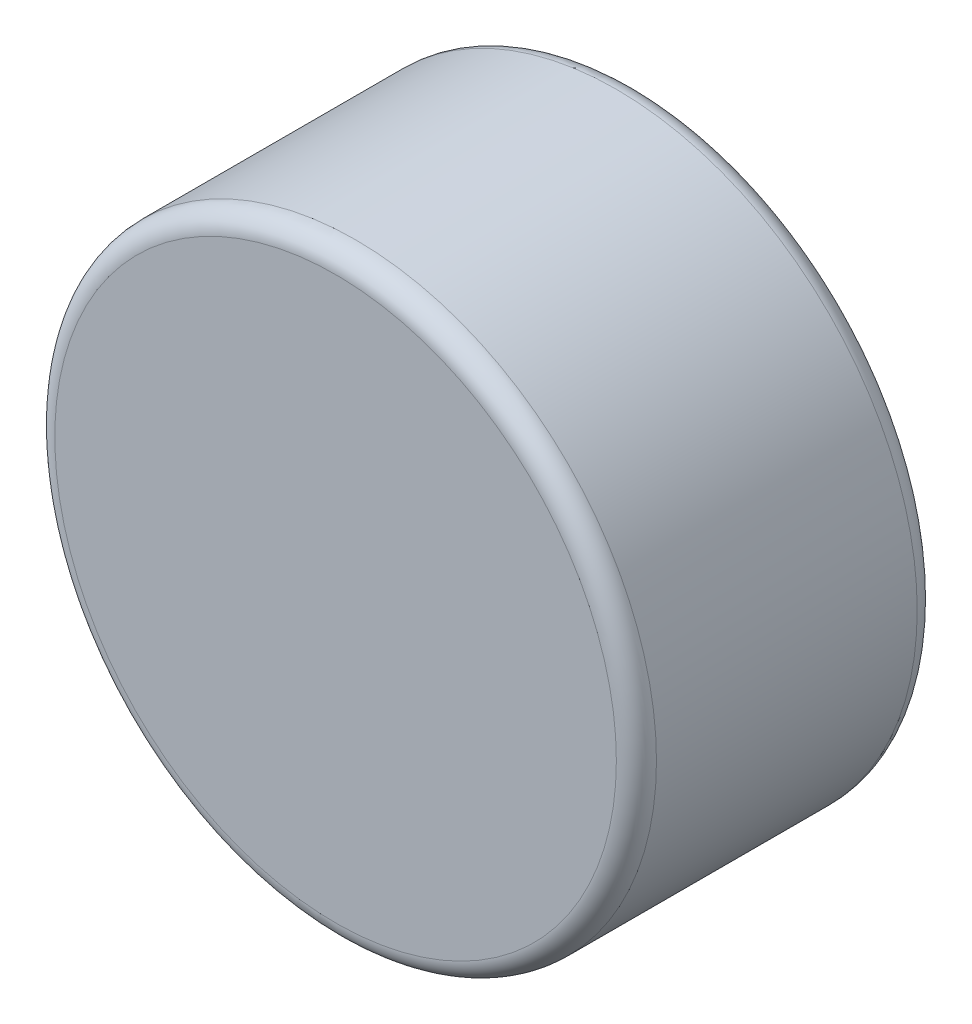
ISO-10303-21;
HEADER;
FILE_DESCRIPTION(('STEP AP214'),'2;1');
FILE_NAME('part.step','',(''),(''),'','','');
FILE_SCHEMA(('AUTOMOTIVE_DESIGN { 1 0 10303 214 1 1 1 1 }'));
ENDSEC;
DATA;
#1=APPLICATION_CONTEXT('core data for automotive mechanical design processes');
#2=APPLICATION_PROTOCOL_DEFINITION('international standard','automotive_design',2000,#1);
#3=PRODUCT_CONTEXT('',#1,'mechanical');
#4=PRODUCT('Part','Part','',(#3));
#5=PRODUCT_RELATED_PRODUCT_CATEGORY('part','',(#4));
#6=PRODUCT_DEFINITION_FORMATION('','',#4);
#7=PRODUCT_DEFINITION_CONTEXT('part definition',#1,'design');
#8=PRODUCT_DEFINITION('design','',#6,#7);
#9=PRODUCT_DEFINITION_SHAPE('','',#8);
#10=(LENGTH_UNIT() NAMED_UNIT(*) SI_UNIT(.MILLI.,.METRE.));
#11=(NAMED_UNIT(*) PLANE_ANGLE_UNIT() SI_UNIT($,.RADIAN.));
#12=(NAMED_UNIT(*) SI_UNIT($,.STERADIAN.) SOLID_ANGLE_UNIT());
#13=UNCERTAINTY_MEASURE_WITH_UNIT(LENGTH_MEASURE(1.E-05),#10,'distance_accuracy_value','');
#14=(GEOMETRIC_REPRESENTATION_CONTEXT(3) GLOBAL_UNCERTAINTY_ASSIGNED_CONTEXT((#13)) GLOBAL_UNIT_ASSIGNED_CONTEXT((#10,
#11,#12)) REPRESENTATION_CONTEXT('',''));
#15=CARTESIAN_POINT('',(0.,0.,0.));
#16=DIRECTION('',(0.,0.,1.));
#17=DIRECTION('',(1.,0.,0.));
#18=AXIS2_PLACEMENT_3D('',#15,#16,#17);
#19=CARTESIAN_POINT('',(0.,0.,3.));
#20=DIRECTION('',(0.,0.,-1.));
#21=DIRECTION('',(-1.,0.,0.));
#22=AXIS2_PLACEMENT_3D('',#19,#20,#21);
#23=CYLINDRICAL_SURFACE('',#22,3.);
#24=CARTESIAN_POINT('',(0.,0.,0.2));
#25=DIRECTION('',(0.,0.,1.));
#26=DIRECTION('',(1.,0.,0.));
#27=AXIS2_PLACEMENT_3D('',#24,#25,#26);
#28=CIRCLE('',#27,3.);
#29=CARTESIAN_POINT('',(3.,0.,0.2));
#30=VERTEX_POINT('',#29);
#31=EDGE_CURVE('E48',#30,#30,#28,.T.);
#32=ORIENTED_EDGE('',*,*,#31,.T.);
#33=EDGE_LOOP('',(#32));
#34=FACE_BOUND('',#33,.T.);
#35=CARTESIAN_POINT('',(0.,0.,2.8));
#36=DIRECTION('',(0.,0.,1.));
#37=DIRECTION('',(1.,0.,0.));
#38=AXIS2_PLACEMENT_3D('',#35,#36,#37);
#39=CIRCLE('',#38,3.);
#40=CARTESIAN_POINT('',(3.,0.,2.8));
#41=VERTEX_POINT('',#40);
#42=EDGE_CURVE('E52',#41,#41,#39,.F.);
#43=ORIENTED_EDGE('',*,*,#42,.T.);
#44=EDGE_LOOP('',(#43));
#45=FACE_BOUND('',#44,.T.);
#46=ADVANCED_FACE('F37',(#34,#45),#23,.T.);
#47=CARTESIAN_POINT('',(0.,0.,3.));
#48=DIRECTION('',(0.,0.,1.));
#49=DIRECTION('',(1.,0.,0.));
#50=AXIS2_PLACEMENT_3D('',#47,#48,#49);
#51=PLANE('',#50);
#52=CARTESIAN_POINT('',(0.,0.,3.));
#53=DIRECTION('',(0.,0.,1.));
#54=DIRECTION('',(1.,0.,0.));
#55=AXIS2_PLACEMENT_3D('',#52,#53,#54);
#56=CIRCLE('',#55,2.8);
#57=CARTESIAN_POINT('',(2.8,0.,3.));
#58=VERTEX_POINT('',#57);
#59=EDGE_CURVE('E10',#58,#58,#56,.T.);
#60=ORIENTED_EDGE('',*,*,#59,.T.);
#61=EDGE_LOOP('',(#60));
#62=FACE_BOUND('',#61,.T.);
#63=ADVANCED_FACE('F68',(#62),#51,.T.);
#64=CARTESIAN_POINT('',(0.,0.,0.));
#65=DIRECTION('',(0.,0.,1.));
#66=DIRECTION('',(1.,0.,0.));
#67=AXIS2_PLACEMENT_3D('',#64,#65,#66);
#68=PLANE('',#67);
#69=CARTESIAN_POINT('',(0.,0.,0.));
#70=DIRECTION('',(0.,0.,1.));
#71=DIRECTION('',(1.,0.,0.));
#72=AXIS2_PLACEMENT_3D('',#69,#70,#71);
#73=CIRCLE('',#72,2.8);
#74=CARTESIAN_POINT('',(2.8,0.,0.));
#75=VERTEX_POINT('',#74);
#76=EDGE_CURVE('E44',#75,#75,#73,.F.);
#77=ORIENTED_EDGE('',*,*,#76,.T.);
#78=EDGE_LOOP('',(#77));
#79=FACE_BOUND('',#78,.T.);
#80=ADVANCED_FACE('F65',(#79),#68,.F.);
#81=CARTESIAN_POINT('',(0.,0.,0.2));
#82=DIRECTION('',(0.,0.,1.));
#83=DIRECTION('',(1.,0.,0.));
#84=AXIS2_PLACEMENT_3D('',#81,#82,#83);
#85=TOROIDAL_SURFACE('',#84,2.8,0.2);
#86=ORIENTED_EDGE('',*,*,#76,.F.);
#87=EDGE_LOOP('',(#86));
#88=FACE_BOUND('',#87,.T.);
#89=ORIENTED_EDGE('',*,*,#31,.F.);
#90=EDGE_LOOP('',(#89));
#91=FACE_BOUND('',#90,.T.);
#92=ADVANCED_FACE('F61',(#88,#91),#85,.T.);
#93=CARTESIAN_POINT('',(0.,0.,2.8));
#94=DIRECTION('',(0.,0.,1.));
#95=DIRECTION('',(1.,0.,0.));
#96=AXIS2_PLACEMENT_3D('',#93,#94,#95);
#97=TOROIDAL_SURFACE('',#96,2.8,0.2);
#98=ORIENTED_EDGE('',*,*,#42,.F.);
#99=EDGE_LOOP('',(#98));
#100=FACE_BOUND('',#99,.T.);
#101=ORIENTED_EDGE('',*,*,#59,.F.);
#102=EDGE_LOOP('',(#101));
#103=FACE_BOUND('',#102,.T.);
#104=ADVANCED_FACE('F39',(#100,#103),#97,.T.);
#105=CLOSED_SHELL('',(#46,#63,#80,#92,#104));
#106=MANIFOLD_SOLID_BREP('B2',#105);
#107=ADVANCED_BREP_SHAPE_REPRESENTATION('',(#18,#106),#14);
#108=SHAPE_DEFINITION_REPRESENTATION(#9,#107);
ENDSEC;
END-ISO-10303-21;
